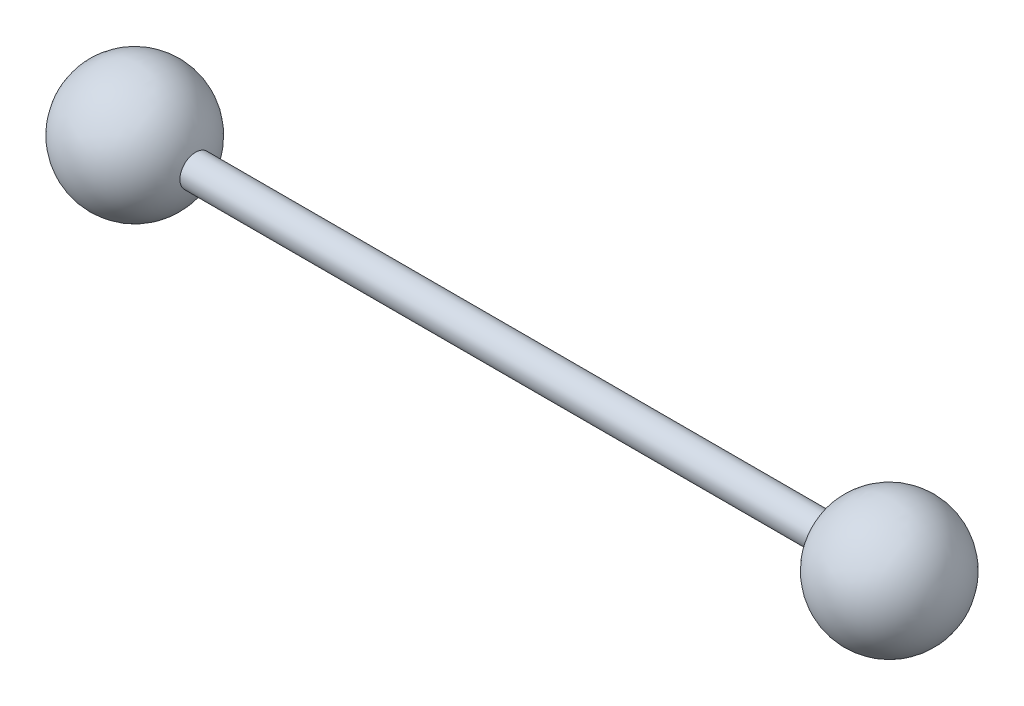
ISO-10303-21;
HEADER;
FILE_DESCRIPTION(('STEP AP214'),'2;1');
FILE_NAME('part.step','',(''),(''),'','','');
FILE_SCHEMA(('AUTOMOTIVE_DESIGN { 1 0 10303 214 1 1 1 1 }'));
ENDSEC;
DATA;
#1=APPLICATION_CONTEXT('core data for automotive mechanical design processes');
#2=APPLICATION_PROTOCOL_DEFINITION('international standard','automotive_design',2000,#1);
#3=PRODUCT_CONTEXT('',#1,'mechanical');
#4=PRODUCT('Part','Part','',(#3));
#5=PRODUCT_RELATED_PRODUCT_CATEGORY('part','',(#4));
#6=PRODUCT_DEFINITION_FORMATION('','',#4);
#7=PRODUCT_DEFINITION_CONTEXT('part definition',#1,'design');
#8=PRODUCT_DEFINITION('design','',#6,#7);
#9=PRODUCT_DEFINITION_SHAPE('','',#8);
#10=(LENGTH_UNIT() NAMED_UNIT(*) SI_UNIT(.MILLI.,.METRE.));
#11=(NAMED_UNIT(*) PLANE_ANGLE_UNIT() SI_UNIT($,.RADIAN.));
#12=(NAMED_UNIT(*) SI_UNIT($,.STERADIAN.) SOLID_ANGLE_UNIT());
#13=UNCERTAINTY_MEASURE_WITH_UNIT(LENGTH_MEASURE(1.E-05),#10,'distance_accuracy_value','');
#14=(GEOMETRIC_REPRESENTATION_CONTEXT(3) GLOBAL_UNCERTAINTY_ASSIGNED_CONTEXT((#13)) GLOBAL_UNIT_ASSIGNED_CONTEXT((#10,
#11,#12)) REPRESENTATION_CONTEXT('',''));
#15=CARTESIAN_POINT('',(0.,0.,0.));
#16=DIRECTION('',(0.,0.,1.));
#17=DIRECTION('',(1.,0.,0.));
#18=AXIS2_PLACEMENT_3D('',#15,#16,#17);
#19=CARTESIAN_POINT('',(0.,0.,0.));
#20=DIRECTION('',(-1.,0.,0.));
#21=DIRECTION('',(0.,1.,0.));
#22=AXIS2_PLACEMENT_3D('',#19,#20,#21);
#23=SPHERICAL_SURFACE('',#22,10.);
#24=CARTESIAN_POINT('',(9.68245836551854,0.,0.));
#25=DIRECTION('',(-1.,0.,0.));
#26=DIRECTION('',(0.,0.,1.));
#27=AXIS2_PLACEMENT_3D('',#24,#25,#26);
#28=CIRCLE('',#27,2.5);
#29=CARTESIAN_POINT('',(9.68245836551854,0.,2.5));
#30=VERTEX_POINT('',#29);
#31=EDGE_CURVE('E10',#30,#30,#28,.F.);
#32=ORIENTED_EDGE('',*,*,#31,.F.);
#33=EDGE_LOOP('',(#32));
#34=FACE_BOUND('',#33,.T.);
#35=ADVANCED_FACE('F31',(#34),#23,.T.);
#36=CARTESIAN_POINT('',(130.001,0.,0.));
#37=DIRECTION('',(-1.,0.,0.));
#38=DIRECTION('',(0.,0.,1.));
#39=AXIS2_PLACEMENT_3D('',#36,#37,#38);
#40=CYLINDRICAL_SURFACE('',#39,2.5);
#41=CARTESIAN_POINT('',(110.317541634481,0.,0.));
#42=DIRECTION('',(0.999999999999999,0.,0.));
#43=DIRECTION('',(0.,0.,-1.));
#44=AXIS2_PLACEMENT_3D('',#41,#42,#43);
#45=CIRCLE('',#44,2.5);
#46=CARTESIAN_POINT('',(110.317541634481,0.,-2.5));
#47=VERTEX_POINT('',#46);
#48=EDGE_CURVE('E37',#47,#47,#45,.T.);
#49=ORIENTED_EDGE('',*,*,#48,.F.);
#50=EDGE_LOOP('',(#49));
#51=FACE_BOUND('',#50,.T.);
#52=ORIENTED_EDGE('',*,*,#31,.T.);
#53=EDGE_LOOP('',(#52));
#54=FACE_BOUND('',#53,.T.);
#55=ADVANCED_FACE('F45',(#51,#54),#40,.T.);
#56=CARTESIAN_POINT('',(120.,0.,0.));
#57=DIRECTION('',(-1.,0.,0.));
#58=DIRECTION('',(0.,1.,0.));
#59=AXIS2_PLACEMENT_3D('',#56,#57,#58);
#60=SPHERICAL_SURFACE('',#59,10.);
#61=ORIENTED_EDGE('',*,*,#48,.T.);
#62=EDGE_LOOP('',(#61));
#63=FACE_BOUND('',#62,.T.);
#64=ADVANCED_FACE('F43',(#63),#60,.T.);
#65=CLOSED_SHELL('',(#35,#55,#64));
#66=MANIFOLD_SOLID_BREP('B2',#65);
#67=ADVANCED_BREP_SHAPE_REPRESENTATION('',(#18,#66),#14);
#68=SHAPE_DEFINITION_REPRESENTATION(#9,#67);
ENDSEC;
END-ISO-10303-21;
